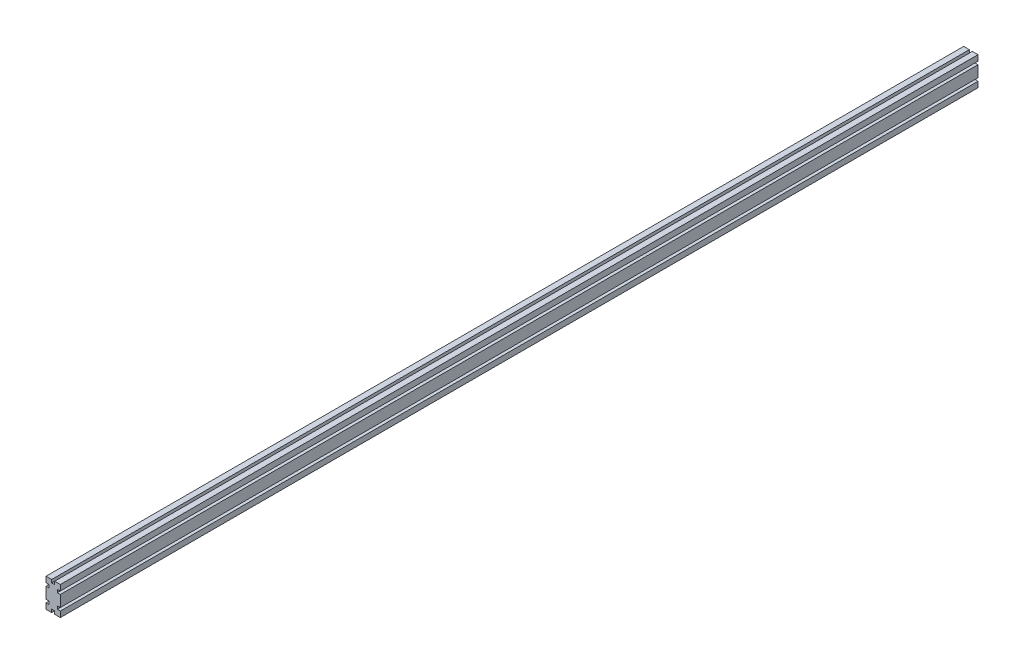
ISO-10303-21;
HEADER;
FILE_DESCRIPTION(('STEP AP214'),'2;1');
FILE_NAME('part.step','',(''),(''),'','','');
FILE_SCHEMA(('AUTOMOTIVE_DESIGN { 1 0 10303 214 1 1 1 1 }'));
ENDSEC;
DATA;
#1=APPLICATION_CONTEXT('core data for automotive mechanical design processes');
#2=APPLICATION_PROTOCOL_DEFINITION('international standard','automotive_design',2000,#1);
#3=PRODUCT_CONTEXT('',#1,'mechanical');
#4=PRODUCT('Part','Part','',(#3));
#5=PRODUCT_RELATED_PRODUCT_CATEGORY('part','',(#4));
#6=PRODUCT_DEFINITION_FORMATION('','',#4);
#7=PRODUCT_DEFINITION_CONTEXT('part definition',#1,'design');
#8=PRODUCT_DEFINITION('design','',#6,#7);
#9=PRODUCT_DEFINITION_SHAPE('','',#8);
#10=(LENGTH_UNIT() NAMED_UNIT(*) SI_UNIT(.MILLI.,.METRE.));
#11=(NAMED_UNIT(*) PLANE_ANGLE_UNIT() SI_UNIT($,.RADIAN.));
#12=(NAMED_UNIT(*) SI_UNIT($,.STERADIAN.) SOLID_ANGLE_UNIT());
#13=UNCERTAINTY_MEASURE_WITH_UNIT(LENGTH_MEASURE(1.E-05),#10,'distance_accuracy_value','');
#14=(GEOMETRIC_REPRESENTATION_CONTEXT(3) GLOBAL_UNCERTAINTY_ASSIGNED_CONTEXT((#13)) GLOBAL_UNIT_ASSIGNED_CONTEXT((#10,
#11,#12)) REPRESENTATION_CONTEXT('',''));
#15=CARTESIAN_POINT('',(0.,0.,0.));
#16=DIRECTION('',(0.,0.,1.));
#17=DIRECTION('',(1.,0.,0.));
#18=AXIS2_PLACEMENT_3D('',#15,#16,#17);
#19=CARTESIAN_POINT('',(-19.05,-23.05,2438.4));
#20=DIRECTION('',(1.,0.,0.));
#21=DIRECTION('',(0.,0.,-1.));
#22=AXIS2_PLACEMENT_3D('',#19,#20,#21);
#23=PLANE('',#22);
#24=DIRECTION('',(0.,-1.,0.));
#25=VECTOR('',#24,1.);
#26=CARTESIAN_POINT('',(-19.05,-23.05,0.));
#27=LINE('',#26,#25);
#28=CARTESIAN_POINT('',(-19.05,-23.05,0.));
#29=VERTEX_POINT('',#28);
#30=CARTESIAN_POINT('',(-19.05,-38.1,0.));
#31=VERTEX_POINT('',#30);
#32=EDGE_CURVE('E255',#29,#31,#27,.T.);
#33=ORIENTED_EDGE('',*,*,#32,.T.);
#34=DIRECTION('',(0.,0.,-1.));
#35=VECTOR('',#34,1.);
#36=CARTESIAN_POINT('',(-19.05,-38.1,2438.4));
#37=LINE('',#36,#35);
#38=CARTESIAN_POINT('',(-19.05,-38.1,2438.4));
#39=VERTEX_POINT('',#38);
#40=EDGE_CURVE('E11',#39,#31,#37,.T.);
#41=ORIENTED_EDGE('',*,*,#40,.F.);
#42=DIRECTION('',(0.,-1.,0.));
#43=VECTOR('',#42,1.);
#44=CARTESIAN_POINT('',(-19.05,-23.05,2438.4));
#45=LINE('',#44,#43);
#46=CARTESIAN_POINT('',(-19.05,-23.05,2438.4));
#47=VERTEX_POINT('',#46);
#48=EDGE_CURVE('E309',#47,#39,#45,.T.);
#49=ORIENTED_EDGE('',*,*,#48,.F.);
#50=DIRECTION('',(0.,0.,-1.));
#51=VECTOR('',#50,1.);
#52=CARTESIAN_POINT('',(-19.05,-23.05,2438.4));
#53=LINE('',#52,#51);
#54=EDGE_CURVE('E251',#47,#29,#53,.T.);
#55=ORIENTED_EDGE('',*,*,#54,.T.);
#56=EDGE_LOOP('',(#33,#41,#49,#55));
#57=FACE_BOUND('',#56,.T.);
#58=ADVANCED_FACE('F39',(#57),#23,.F.);
#59=CARTESIAN_POINT('',(-19.05,-38.1,2438.4));
#60=DIRECTION('',(0.,1.,0.));
#61=DIRECTION('',(0.,0.,1.));
#62=AXIS2_PLACEMENT_3D('',#59,#60,#61);
#63=PLANE('',#62);
#64=DIRECTION('',(1.,0.,0.));
#65=VECTOR('',#64,1.);
#66=CARTESIAN_POINT('',(-19.05,-38.1,0.));
#67=LINE('',#66,#65);
#68=CARTESIAN_POINT('',(-4.,-38.1,0.));
#69=VERTEX_POINT('',#68);
#70=EDGE_CURVE('E258',#31,#69,#67,.T.);
#71=ORIENTED_EDGE('',*,*,#70,.T.);
#72=DIRECTION('',(0.,0.,-1.));
#73=VECTOR('',#72,1.);
#74=CARTESIAN_POINT('',(-4.,-38.1,2438.4));
#75=LINE('',#74,#73);
#76=CARTESIAN_POINT('',(-4.,-38.1,2438.4));
#77=VERTEX_POINT('',#76);
#78=EDGE_CURVE('E47',#77,#69,#75,.T.);
#79=ORIENTED_EDGE('',*,*,#78,.F.);
#80=DIRECTION('',(1.,0.,0.));
#81=VECTOR('',#80,1.);
#82=CARTESIAN_POINT('',(-19.05,-38.1,2438.4));
#83=LINE('',#82,#81);
#84=EDGE_CURVE('E158',#39,#77,#83,.T.);
#85=ORIENTED_EDGE('',*,*,#84,.F.);
#86=ORIENTED_EDGE('',*,*,#40,.T.);
#87=EDGE_LOOP('',(#71,#79,#85,#86));
#88=FACE_BOUND('',#87,.T.);
#89=ADVANCED_FACE('F467',(#88),#63,.F.);
#90=CARTESIAN_POINT('',(-4.,-38.1,2438.4));
#91=DIRECTION('',(-1.,0.,0.));
#92=DIRECTION('',(0.,0.,1.));
#93=AXIS2_PLACEMENT_3D('',#90,#91,#92);
#94=PLANE('',#93);
#95=DIRECTION('',(0.,1.,0.));
#96=VECTOR('',#95,1.);
#97=CARTESIAN_POINT('',(-4.,-38.1,0.));
#98=LINE('',#97,#96);
#99=CARTESIAN_POINT('',(-4.,-30.1,0.));
#100=VERTEX_POINT('',#99);
#101=EDGE_CURVE('E260',#69,#100,#98,.T.);
#102=ORIENTED_EDGE('',*,*,#101,.T.);
#103=DIRECTION('',(0.,0.,-1.));
#104=VECTOR('',#103,1.);
#105=CARTESIAN_POINT('',(-4.,-30.1,2438.4));
#106=LINE('',#105,#104);
#107=CARTESIAN_POINT('',(-4.,-30.1,2438.4));
#108=VERTEX_POINT('',#107);
#109=EDGE_CURVE('E376',#108,#100,#106,.T.);
#110=ORIENTED_EDGE('',*,*,#109,.F.);
#111=DIRECTION('',(0.,1.,0.));
#112=VECTOR('',#111,1.);
#113=CARTESIAN_POINT('',(-4.,-38.1,2438.4));
#114=LINE('',#113,#112);
#115=EDGE_CURVE('E384',#77,#108,#114,.T.);
#116=ORIENTED_EDGE('',*,*,#115,.F.);
#117=ORIENTED_EDGE('',*,*,#78,.T.);
#118=EDGE_LOOP('',(#102,#110,#116,#117));
#119=FACE_BOUND('',#118,.T.);
#120=ADVANCED_FACE('F382',(#119),#94,.F.);
#121=CARTESIAN_POINT('',(-4.,-30.1,2438.4));
#122=DIRECTION('',(0.,1.,0.));
#123=DIRECTION('',(0.,0.,1.));
#124=AXIS2_PLACEMENT_3D('',#121,#122,#123);
#125=PLANE('',#124);
#126=DIRECTION('',(1.,0.,0.));
#127=VECTOR('',#126,1.);
#128=CARTESIAN_POINT('',(-4.,-30.1,0.));
#129=LINE('',#128,#127);
#130=CARTESIAN_POINT('',(4.,-30.1,0.));
#131=VERTEX_POINT('',#130);
#132=EDGE_CURVE('E262',#100,#131,#129,.T.);
#133=ORIENTED_EDGE('',*,*,#132,.T.);
#134=DIRECTION('',(0.,0.,-1.));
#135=VECTOR('',#134,1.);
#136=CARTESIAN_POINT('',(4.,-30.1,2438.4));
#137=LINE('',#136,#135);
#138=CARTESIAN_POINT('',(4.,-30.1,2438.4));
#139=VERTEX_POINT('',#138);
#140=EDGE_CURVE('E373',#139,#131,#137,.T.);
#141=ORIENTED_EDGE('',*,*,#140,.F.);
#142=DIRECTION('',(1.,0.,0.));
#143=VECTOR('',#142,1.);
#144=CARTESIAN_POINT('',(-4.,-30.1,2438.4));
#145=LINE('',#144,#143);
#146=EDGE_CURVE('E402',#108,#139,#145,.T.);
#147=ORIENTED_EDGE('',*,*,#146,.F.);
#148=ORIENTED_EDGE('',*,*,#109,.T.);
#149=EDGE_LOOP('',(#133,#141,#147,#148));
#150=FACE_BOUND('',#149,.T.);
#151=ADVANCED_FACE('F393',(#150),#125,.F.);
#152=CARTESIAN_POINT('',(4.,-30.1,2438.4));
#153=DIRECTION('',(1.,0.,0.));
#154=DIRECTION('',(0.,0.,-1.));
#155=AXIS2_PLACEMENT_3D('',#152,#153,#154);
#156=PLANE('',#155);
#157=DIRECTION('',(0.,-1.,0.));
#158=VECTOR('',#157,1.);
#159=CARTESIAN_POINT('',(4.,-30.1,0.));
#160=LINE('',#159,#158);
#161=CARTESIAN_POINT('',(4.,-38.1,0.));
#162=VERTEX_POINT('',#161);
#163=EDGE_CURVE('E264',#131,#162,#160,.T.);
#164=ORIENTED_EDGE('',*,*,#163,.T.);
#165=DIRECTION('',(0.,0.,-1.));
#166=VECTOR('',#165,1.);
#167=CARTESIAN_POINT('',(4.,-38.1,2438.4));
#168=LINE('',#167,#166);
#169=CARTESIAN_POINT('',(4.,-38.1,2438.4));
#170=VERTEX_POINT('',#169);
#171=EDGE_CURVE('E370',#170,#162,#168,.T.);
#172=ORIENTED_EDGE('',*,*,#171,.F.);
#173=DIRECTION('',(0.,-1.,0.));
#174=VECTOR('',#173,1.);
#175=CARTESIAN_POINT('',(4.,-30.1,2438.4));
#176=LINE('',#175,#174);
#177=EDGE_CURVE('E399',#139,#170,#176,.T.);
#178=ORIENTED_EDGE('',*,*,#177,.F.);
#179=ORIENTED_EDGE('',*,*,#140,.T.);
#180=EDGE_LOOP('',(#164,#172,#178,#179));
#181=FACE_BOUND('',#180,.T.);
#182=ADVANCED_FACE('F397',(#181),#156,.F.);
#183=CARTESIAN_POINT('',(4.,-38.1,2438.4));
#184=DIRECTION('',(0.,1.,0.));
#185=DIRECTION('',(0.,0.,1.));
#186=AXIS2_PLACEMENT_3D('',#183,#184,#185);
#187=PLANE('',#186);
#188=DIRECTION('',(1.,0.,0.));
#189=VECTOR('',#188,1.);
#190=CARTESIAN_POINT('',(4.,-38.1,0.));
#191=LINE('',#190,#189);
#192=CARTESIAN_POINT('',(19.05,-38.1,0.));
#193=VERTEX_POINT('',#192);
#194=EDGE_CURVE('E266',#162,#193,#191,.T.);
#195=ORIENTED_EDGE('',*,*,#194,.T.);
#196=DIRECTION('',(0.,0.,-1.));
#197=VECTOR('',#196,1.);
#198=CARTESIAN_POINT('',(19.05,-38.1,2438.4));
#199=LINE('',#198,#197);
#200=CARTESIAN_POINT('',(19.05,-38.1,2438.4));
#201=VERTEX_POINT('',#200);
#202=EDGE_CURVE('E367',#201,#193,#199,.T.);
#203=ORIENTED_EDGE('',*,*,#202,.F.);
#204=DIRECTION('',(1.,0.,0.));
#205=VECTOR('',#204,1.);
#206=CARTESIAN_POINT('',(4.,-38.1,2438.4));
#207=LINE('',#206,#205);
#208=EDGE_CURVE('E401',#170,#201,#207,.T.);
#209=ORIENTED_EDGE('',*,*,#208,.F.);
#210=ORIENTED_EDGE('',*,*,#171,.T.);
#211=EDGE_LOOP('',(#195,#203,#209,#210));
#212=FACE_BOUND('',#211,.T.);
#213=ADVANCED_FACE('F480',(#212),#187,.F.);
#214=CARTESIAN_POINT('',(19.05,-38.1,2438.4));
#215=DIRECTION('',(-1.,0.,0.));
#216=DIRECTION('',(0.,0.,1.));
#217=AXIS2_PLACEMENT_3D('',#214,#215,#216);
#218=PLANE('',#217);
#219=DIRECTION('',(0.,1.,0.));
#220=VECTOR('',#219,1.);
#221=CARTESIAN_POINT('',(19.05,-38.1,0.));
#222=LINE('',#221,#220);
#223=CARTESIAN_POINT('',(19.05,-23.05,0.));
#224=VERTEX_POINT('',#223);
#225=EDGE_CURVE('E268',#193,#224,#222,.T.);
#226=ORIENTED_EDGE('',*,*,#225,.T.);
#227=DIRECTION('',(0.,0.,-1.));
#228=VECTOR('',#227,1.);
#229=CARTESIAN_POINT('',(19.05,-23.05,2438.4));
#230=LINE('',#229,#228);
#231=CARTESIAN_POINT('',(19.05,-23.05,2438.4));
#232=VERTEX_POINT('',#231);
#233=EDGE_CURVE('E364',#232,#224,#230,.T.);
#234=ORIENTED_EDGE('',*,*,#233,.F.);
#235=DIRECTION('',(0.,1.,0.));
#236=VECTOR('',#235,1.);
#237=CARTESIAN_POINT('',(19.05,-38.1,2438.4));
#238=LINE('',#237,#236);
#239=EDGE_CURVE('E404',#201,#232,#238,.T.);
#240=ORIENTED_EDGE('',*,*,#239,.F.);
#241=ORIENTED_EDGE('',*,*,#202,.T.);
#242=EDGE_LOOP('',(#226,#234,#240,#241));
#243=FACE_BOUND('',#242,.T.);
#244=ADVANCED_FACE('F483',(#243),#218,.F.);
#245=CARTESIAN_POINT('',(19.05,-23.05,2438.4));
#246=DIRECTION('',(0.,-1.,0.));
#247=DIRECTION('',(0.,0.,-1.));
#248=AXIS2_PLACEMENT_3D('',#245,#246,#247);
#249=PLANE('',#248);
#250=DIRECTION('',(-1.,0.,0.));
#251=VECTOR('',#250,1.);
#252=CARTESIAN_POINT('',(19.05,-23.05,0.));
#253=LINE('',#252,#251);
#254=CARTESIAN_POINT('',(11.05,-23.05,0.));
#255=VERTEX_POINT('',#254);
#256=EDGE_CURVE('E270',#224,#255,#253,.T.);
#257=ORIENTED_EDGE('',*,*,#256,.T.);
#258=DIRECTION('',(0.,0.,-1.));
#259=VECTOR('',#258,1.);
#260=CARTESIAN_POINT('',(11.05,-23.05,2438.4));
#261=LINE('',#260,#259);
#262=CARTESIAN_POINT('',(11.05,-23.05,2438.4));
#263=VERTEX_POINT('',#262);
#264=EDGE_CURVE('E361',#263,#255,#261,.T.);
#265=ORIENTED_EDGE('',*,*,#264,.F.);
#266=DIRECTION('',(-1.,0.,0.));
#267=VECTOR('',#266,1.);
#268=CARTESIAN_POINT('',(19.05,-23.05,2438.4));
#269=LINE('',#268,#267);
#270=EDGE_CURVE('E410',#232,#263,#269,.T.);
#271=ORIENTED_EDGE('',*,*,#270,.F.);
#272=ORIENTED_EDGE('',*,*,#233,.T.);
#273=EDGE_LOOP('',(#257,#265,#271,#272));
#274=FACE_BOUND('',#273,.T.);
#275=ADVANCED_FACE('F487',(#274),#249,.F.);
#276=CARTESIAN_POINT('',(11.05,-23.05,2438.4));
#277=DIRECTION('',(-1.,0.,0.));
#278=DIRECTION('',(0.,0.,1.));
#279=AXIS2_PLACEMENT_3D('',#276,#277,#278);
#280=PLANE('',#279);
#281=DIRECTION('',(0.,1.,0.));
#282=VECTOR('',#281,1.);
#283=CARTESIAN_POINT('',(11.05,-23.05,0.));
#284=LINE('',#283,#282);
#285=CARTESIAN_POINT('',(11.05,-15.05,0.));
#286=VERTEX_POINT('',#285);
#287=EDGE_CURVE('E272',#255,#286,#284,.T.);
#288=ORIENTED_EDGE('',*,*,#287,.T.);
#289=DIRECTION('',(0.,0.,-1.));
#290=VECTOR('',#289,1.);
#291=CARTESIAN_POINT('',(11.05,-15.05,2438.4));
#292=LINE('',#291,#290);
#293=CARTESIAN_POINT('',(11.05,-15.05,2438.4));
#294=VERTEX_POINT('',#293);
#295=EDGE_CURVE('E358',#294,#286,#292,.T.);
#296=ORIENTED_EDGE('',*,*,#295,.F.);
#297=DIRECTION('',(0.,1.,0.));
#298=VECTOR('',#297,1.);
#299=CARTESIAN_POINT('',(11.05,-23.05,2438.4));
#300=LINE('',#299,#298);
#301=EDGE_CURVE('E412',#263,#294,#300,.T.);
#302=ORIENTED_EDGE('',*,*,#301,.F.);
#303=ORIENTED_EDGE('',*,*,#264,.T.);
#304=EDGE_LOOP('',(#288,#296,#302,#303));
#305=FACE_BOUND('',#304,.T.);
#306=ADVANCED_FACE('F491',(#305),#280,.F.);
#307=CARTESIAN_POINT('',(11.05,-15.05,2438.4));
#308=DIRECTION('',(0.,1.,0.));
#309=DIRECTION('',(0.,0.,1.));
#310=AXIS2_PLACEMENT_3D('',#307,#308,#309);
#311=PLANE('',#310);
#312=DIRECTION('',(1.,0.,0.));
#313=VECTOR('',#312,1.);
#314=CARTESIAN_POINT('',(11.05,-15.05,0.));
#315=LINE('',#314,#313);
#316=CARTESIAN_POINT('',(19.05,-15.05,0.));
#317=VERTEX_POINT('',#316);
#318=EDGE_CURVE('E274',#286,#317,#315,.T.);
#319=ORIENTED_EDGE('',*,*,#318,.T.);
#320=DIRECTION('',(0.,0.,-1.));
#321=VECTOR('',#320,1.);
#322=CARTESIAN_POINT('',(19.05,-15.05,2438.4));
#323=LINE('',#322,#321);
#324=CARTESIAN_POINT('',(19.05,-15.05,2438.4));
#325=VERTEX_POINT('',#324);
#326=EDGE_CURVE('E355',#325,#317,#323,.T.);
#327=ORIENTED_EDGE('',*,*,#326,.F.);
#328=DIRECTION('',(1.,0.,0.));
#329=VECTOR('',#328,1.);
#330=CARTESIAN_POINT('',(11.05,-15.05,2438.4));
#331=LINE('',#330,#329);
#332=EDGE_CURVE('E414',#294,#325,#331,.T.);
#333=ORIENTED_EDGE('',*,*,#332,.F.);
#334=ORIENTED_EDGE('',*,*,#295,.T.);
#335=EDGE_LOOP('',(#319,#327,#333,#334));
#336=FACE_BOUND('',#335,.T.);
#337=ADVANCED_FACE('F495',(#336),#311,.F.);
#338=CARTESIAN_POINT('',(19.05,-15.05,2438.4));
#339=DIRECTION('',(-1.,0.,0.));
#340=DIRECTION('',(0.,0.,1.));
#341=AXIS2_PLACEMENT_3D('',#338,#339,#340);
#342=PLANE('',#341);
#343=DIRECTION('',(0.,1.,0.));
#344=VECTOR('',#343,1.);
#345=CARTESIAN_POINT('',(19.05,-15.05,0.));
#346=LINE('',#345,#344);
#347=CARTESIAN_POINT('',(19.05,15.05,0.));
#348=VERTEX_POINT('',#347);
#349=EDGE_CURVE('E276',#317,#348,#346,.T.);
#350=ORIENTED_EDGE('',*,*,#349,.T.);
#351=DIRECTION('',(0.,0.,-1.));
#352=VECTOR('',#351,1.);
#353=CARTESIAN_POINT('',(19.05,15.05,2438.4));
#354=LINE('',#353,#352);
#355=CARTESIAN_POINT('',(19.05,15.05,2438.4));
#356=VERTEX_POINT('',#355);
#357=EDGE_CURVE('E352',#356,#348,#354,.T.);
#358=ORIENTED_EDGE('',*,*,#357,.F.);
#359=DIRECTION('',(0.,1.,0.));
#360=VECTOR('',#359,1.);
#361=CARTESIAN_POINT('',(19.05,-15.05,2438.4));
#362=LINE('',#361,#360);
#363=EDGE_CURVE('E416',#325,#356,#362,.T.);
#364=ORIENTED_EDGE('',*,*,#363,.F.);
#365=ORIENTED_EDGE('',*,*,#326,.T.);
#366=EDGE_LOOP('',(#350,#358,#364,#365));
#367=FACE_BOUND('',#366,.T.);
#368=ADVANCED_FACE('F499',(#367),#342,.F.);
#369=CARTESIAN_POINT('',(19.05,15.05,2438.4));
#370=DIRECTION('',(0.,-1.,0.));
#371=DIRECTION('',(0.,0.,-1.));
#372=AXIS2_PLACEMENT_3D('',#369,#370,#371);
#373=PLANE('',#372);
#374=DIRECTION('',(-1.,0.,0.));
#375=VECTOR('',#374,1.);
#376=CARTESIAN_POINT('',(19.05,15.05,0.));
#377=LINE('',#376,#375);
#378=CARTESIAN_POINT('',(11.05,15.05,0.));
#379=VERTEX_POINT('',#378);
#380=EDGE_CURVE('E278',#348,#379,#377,.T.);
#381=ORIENTED_EDGE('',*,*,#380,.T.);
#382=DIRECTION('',(0.,0.,-1.));
#383=VECTOR('',#382,1.);
#384=CARTESIAN_POINT('',(11.05,15.05,2438.4));
#385=LINE('',#384,#383);
#386=CARTESIAN_POINT('',(11.05,15.05,2438.4));
#387=VERTEX_POINT('',#386);
#388=EDGE_CURVE('E349',#387,#379,#385,.T.);
#389=ORIENTED_EDGE('',*,*,#388,.F.);
#390=DIRECTION('',(-1.,0.,0.));
#391=VECTOR('',#390,1.);
#392=CARTESIAN_POINT('',(19.05,15.05,2438.4));
#393=LINE('',#392,#391);
#394=EDGE_CURVE('E418',#356,#387,#393,.T.);
#395=ORIENTED_EDGE('',*,*,#394,.F.);
#396=ORIENTED_EDGE('',*,*,#357,.T.);
#397=EDGE_LOOP('',(#381,#389,#395,#396));
#398=FACE_BOUND('',#397,.T.);
#399=ADVANCED_FACE('F503',(#398),#373,.F.);
#400=CARTESIAN_POINT('',(11.05,15.05,2438.4));
#401=DIRECTION('',(-1.,0.,0.));
#402=DIRECTION('',(0.,0.,1.));
#403=AXIS2_PLACEMENT_3D('',#400,#401,#402);
#404=PLANE('',#403);
#405=DIRECTION('',(0.,1.,0.));
#406=VECTOR('',#405,1.);
#407=CARTESIAN_POINT('',(11.05,15.05,0.));
#408=LINE('',#407,#406);
#409=CARTESIAN_POINT('',(11.05,23.05,0.));
#410=VERTEX_POINT('',#409);
#411=EDGE_CURVE('E280',#379,#410,#408,.T.);
#412=ORIENTED_EDGE('',*,*,#411,.T.);
#413=DIRECTION('',(0.,0.,-1.));
#414=VECTOR('',#413,1.);
#415=CARTESIAN_POINT('',(11.05,23.05,2438.4));
#416=LINE('',#415,#414);
#417=CARTESIAN_POINT('',(11.05,23.05,2438.4));
#418=VERTEX_POINT('',#417);
#419=EDGE_CURVE('E346',#418,#410,#416,.T.);
#420=ORIENTED_EDGE('',*,*,#419,.F.);
#421=DIRECTION('',(0.,1.,0.));
#422=VECTOR('',#421,1.);
#423=CARTESIAN_POINT('',(11.05,15.05,2438.4));
#424=LINE('',#423,#422);
#425=EDGE_CURVE('E420',#387,#418,#424,.T.);
#426=ORIENTED_EDGE('',*,*,#425,.F.);
#427=ORIENTED_EDGE('',*,*,#388,.T.);
#428=EDGE_LOOP('',(#412,#420,#426,#427));
#429=FACE_BOUND('',#428,.T.);
#430=ADVANCED_FACE('F507',(#429),#404,.F.);
#431=CARTESIAN_POINT('',(11.05,23.05,2438.4));
#432=DIRECTION('',(0.,1.,0.));
#433=DIRECTION('',(0.,0.,1.));
#434=AXIS2_PLACEMENT_3D('',#431,#432,#433);
#435=PLANE('',#434);
#436=DIRECTION('',(1.,0.,0.));
#437=VECTOR('',#436,1.);
#438=CARTESIAN_POINT('',(11.05,23.05,0.));
#439=LINE('',#438,#437);
#440=CARTESIAN_POINT('',(19.05,23.05,0.));
#441=VERTEX_POINT('',#440);
#442=EDGE_CURVE('E282',#410,#441,#439,.T.);
#443=ORIENTED_EDGE('',*,*,#442,.T.);
#444=DIRECTION('',(0.,0.,-1.));
#445=VECTOR('',#444,1.);
#446=CARTESIAN_POINT('',(19.05,23.05,2438.4));
#447=LINE('',#446,#445);
#448=CARTESIAN_POINT('',(19.05,23.05,2438.4));
#449=VERTEX_POINT('',#448);
#450=EDGE_CURVE('E343',#449,#441,#447,.T.);
#451=ORIENTED_EDGE('',*,*,#450,.F.);
#452=DIRECTION('',(1.,0.,0.));
#453=VECTOR('',#452,1.);
#454=CARTESIAN_POINT('',(11.05,23.05,2438.4));
#455=LINE('',#454,#453);
#456=EDGE_CURVE('E422',#418,#449,#455,.T.);
#457=ORIENTED_EDGE('',*,*,#456,.F.);
#458=ORIENTED_EDGE('',*,*,#419,.T.);
#459=EDGE_LOOP('',(#443,#451,#457,#458));
#460=FACE_BOUND('',#459,.T.);
#461=ADVANCED_FACE('F511',(#460),#435,.F.);
#462=CARTESIAN_POINT('',(19.05,23.05,2438.4));
#463=DIRECTION('',(-1.,0.,0.));
#464=DIRECTION('',(0.,0.,1.));
#465=AXIS2_PLACEMENT_3D('',#462,#463,#464);
#466=PLANE('',#465);
#467=DIRECTION('',(0.,1.,0.));
#468=VECTOR('',#467,1.);
#469=CARTESIAN_POINT('',(19.05,23.05,0.));
#470=LINE('',#469,#468);
#471=CARTESIAN_POINT('',(19.05,38.1,0.));
#472=VERTEX_POINT('',#471);
#473=EDGE_CURVE('E284',#441,#472,#470,.T.);
#474=ORIENTED_EDGE('',*,*,#473,.T.);
#475=DIRECTION('',(0.,0.,-1.));
#476=VECTOR('',#475,1.);
#477=CARTESIAN_POINT('',(19.05,38.1,2438.4));
#478=LINE('',#477,#476);
#479=CARTESIAN_POINT('',(19.05,38.1,2438.4));
#480=VERTEX_POINT('',#479);
#481=EDGE_CURVE('E340',#480,#472,#478,.T.);
#482=ORIENTED_EDGE('',*,*,#481,.F.);
#483=DIRECTION('',(0.,1.,0.));
#484=VECTOR('',#483,1.);
#485=CARTESIAN_POINT('',(19.05,23.05,2438.4));
#486=LINE('',#485,#484);
#487=EDGE_CURVE('E424',#449,#480,#486,.T.);
#488=ORIENTED_EDGE('',*,*,#487,.F.);
#489=ORIENTED_EDGE('',*,*,#450,.T.);
#490=EDGE_LOOP('',(#474,#482,#488,#489));
#491=FACE_BOUND('',#490,.T.);
#492=ADVANCED_FACE('F515',(#491),#466,.F.);
#493=CARTESIAN_POINT('',(19.05,38.1,2438.4));
#494=DIRECTION('',(0.,-1.,0.));
#495=DIRECTION('',(0.,0.,-1.));
#496=AXIS2_PLACEMENT_3D('',#493,#494,#495);
#497=PLANE('',#496);
#498=DIRECTION('',(-1.,0.,0.));
#499=VECTOR('',#498,1.);
#500=CARTESIAN_POINT('',(19.05,38.1,0.));
#501=LINE('',#500,#499);
#502=CARTESIAN_POINT('',(4.,38.1,0.));
#503=VERTEX_POINT('',#502);
#504=EDGE_CURVE('E286',#472,#503,#501,.T.);
#505=ORIENTED_EDGE('',*,*,#504,.T.);
#506=DIRECTION('',(0.,0.,-1.));
#507=VECTOR('',#506,1.);
#508=CARTESIAN_POINT('',(4.,38.1,2438.4));
#509=LINE('',#508,#507);
#510=CARTESIAN_POINT('',(4.,38.1,2438.4));
#511=VERTEX_POINT('',#510);
#512=EDGE_CURVE('E337',#511,#503,#509,.T.);
#513=ORIENTED_EDGE('',*,*,#512,.F.);
#514=DIRECTION('',(-1.,0.,0.));
#515=VECTOR('',#514,1.);
#516=CARTESIAN_POINT('',(19.05,38.1,2438.4));
#517=LINE('',#516,#515);
#518=EDGE_CURVE('E426',#480,#511,#517,.T.);
#519=ORIENTED_EDGE('',*,*,#518,.F.);
#520=ORIENTED_EDGE('',*,*,#481,.T.);
#521=EDGE_LOOP('',(#505,#513,#519,#520));
#522=FACE_BOUND('',#521,.T.);
#523=ADVANCED_FACE('F519',(#522),#497,.F.);
#524=CARTESIAN_POINT('',(4.,38.1,2438.4));
#525=DIRECTION('',(1.,0.,0.));
#526=DIRECTION('',(0.,0.,-1.));
#527=AXIS2_PLACEMENT_3D('',#524,#525,#526);
#528=PLANE('',#527);
#529=DIRECTION('',(0.,-1.,0.));
#530=VECTOR('',#529,1.);
#531=CARTESIAN_POINT('',(4.,38.1,0.));
#532=LINE('',#531,#530);
#533=CARTESIAN_POINT('',(4.,30.1,0.));
#534=VERTEX_POINT('',#533);
#535=EDGE_CURVE('E288',#503,#534,#532,.T.);
#536=ORIENTED_EDGE('',*,*,#535,.T.);
#537=DIRECTION('',(0.,0.,-1.));
#538=VECTOR('',#537,1.);
#539=CARTESIAN_POINT('',(4.,30.1,2438.4));
#540=LINE('',#539,#538);
#541=CARTESIAN_POINT('',(4.,30.1,2438.4));
#542=VERTEX_POINT('',#541);
#543=EDGE_CURVE('E334',#542,#534,#540,.T.);
#544=ORIENTED_EDGE('',*,*,#543,.F.);
#545=DIRECTION('',(0.,-1.,0.));
#546=VECTOR('',#545,1.);
#547=CARTESIAN_POINT('',(4.,38.1,2438.4));
#548=LINE('',#547,#546);
#549=EDGE_CURVE('E428',#511,#542,#548,.T.);
#550=ORIENTED_EDGE('',*,*,#549,.F.);
#551=ORIENTED_EDGE('',*,*,#512,.T.);
#552=EDGE_LOOP('',(#536,#544,#550,#551));
#553=FACE_BOUND('',#552,.T.);
#554=ADVANCED_FACE('F523',(#553),#528,.F.);
#555=CARTESIAN_POINT('',(4.,30.1,2438.4));
#556=DIRECTION('',(0.,-1.,0.));
#557=DIRECTION('',(0.,0.,-1.));
#558=AXIS2_PLACEMENT_3D('',#555,#556,#557);
#559=PLANE('',#558);
#560=DIRECTION('',(-1.,0.,0.));
#561=VECTOR('',#560,1.);
#562=CARTESIAN_POINT('',(4.,30.1,0.));
#563=LINE('',#562,#561);
#564=CARTESIAN_POINT('',(-4.,30.1,0.));
#565=VERTEX_POINT('',#564);
#566=EDGE_CURVE('E290',#534,#565,#563,.T.);
#567=ORIENTED_EDGE('',*,*,#566,.T.);
#568=DIRECTION('',(0.,0.,-1.));
#569=VECTOR('',#568,1.);
#570=CARTESIAN_POINT('',(-4.,30.1,2438.4));
#571=LINE('',#570,#569);
#572=CARTESIAN_POINT('',(-4.,30.1,2438.4));
#573=VERTEX_POINT('',#572);
#574=EDGE_CURVE('E331',#573,#565,#571,.T.);
#575=ORIENTED_EDGE('',*,*,#574,.F.);
#576=DIRECTION('',(-1.,0.,0.));
#577=VECTOR('',#576,1.);
#578=CARTESIAN_POINT('',(4.,30.1,2438.4));
#579=LINE('',#578,#577);
#580=EDGE_CURVE('E430',#542,#573,#579,.T.);
#581=ORIENTED_EDGE('',*,*,#580,.F.);
#582=ORIENTED_EDGE('',*,*,#543,.T.);
#583=EDGE_LOOP('',(#567,#575,#581,#582));
#584=FACE_BOUND('',#583,.T.);
#585=ADVANCED_FACE('F527',(#584),#559,.F.);
#586=CARTESIAN_POINT('',(-4.,30.1,2438.4));
#587=DIRECTION('',(-1.,0.,0.));
#588=DIRECTION('',(0.,0.,1.));
#589=AXIS2_PLACEMENT_3D('',#586,#587,#588);
#590=PLANE('',#589);
#591=DIRECTION('',(0.,1.,0.));
#592=VECTOR('',#591,1.);
#593=CARTESIAN_POINT('',(-4.,30.1,0.));
#594=LINE('',#593,#592);
#595=CARTESIAN_POINT('',(-4.,38.1,0.));
#596=VERTEX_POINT('',#595);
#597=EDGE_CURVE('E292',#565,#596,#594,.T.);
#598=ORIENTED_EDGE('',*,*,#597,.T.);
#599=DIRECTION('',(0.,0.,-1.));
#600=VECTOR('',#599,1.);
#601=CARTESIAN_POINT('',(-4.,38.1,2438.4));
#602=LINE('',#601,#600);
#603=CARTESIAN_POINT('',(-4.,38.1,2438.4));
#604=VERTEX_POINT('',#603);
#605=EDGE_CURVE('E328',#604,#596,#602,.T.);
#606=ORIENTED_EDGE('',*,*,#605,.F.);
#607=DIRECTION('',(0.,1.,0.));
#608=VECTOR('',#607,1.);
#609=CARTESIAN_POINT('',(-4.,30.1,2438.4));
#610=LINE('',#609,#608);
#611=EDGE_CURVE('E432',#573,#604,#610,.T.);
#612=ORIENTED_EDGE('',*,*,#611,.F.);
#613=ORIENTED_EDGE('',*,*,#574,.T.);
#614=EDGE_LOOP('',(#598,#606,#612,#613));
#615=FACE_BOUND('',#614,.T.);
#616=ADVANCED_FACE('F531',(#615),#590,.F.);
#617=CARTESIAN_POINT('',(-4.,38.1,2438.4));
#618=DIRECTION('',(0.,-1.,0.));
#619=DIRECTION('',(0.,0.,-1.));
#620=AXIS2_PLACEMENT_3D('',#617,#618,#619);
#621=PLANE('',#620);
#622=DIRECTION('',(-1.,0.,0.));
#623=VECTOR('',#622,1.);
#624=CARTESIAN_POINT('',(-4.,38.1,0.));
#625=LINE('',#624,#623);
#626=CARTESIAN_POINT('',(-19.05,38.1,0.));
#627=VERTEX_POINT('',#626);
#628=EDGE_CURVE('E294',#596,#627,#625,.T.);
#629=ORIENTED_EDGE('',*,*,#628,.T.);
#630=DIRECTION('',(0.,0.,-1.));
#631=VECTOR('',#630,1.);
#632=CARTESIAN_POINT('',(-19.05,38.1,2438.4));
#633=LINE('',#632,#631);
#634=CARTESIAN_POINT('',(-19.05,38.1,2438.4));
#635=VERTEX_POINT('',#634);
#636=EDGE_CURVE('E325',#635,#627,#633,.T.);
#637=ORIENTED_EDGE('',*,*,#636,.F.);
#638=DIRECTION('',(-1.,0.,0.));
#639=VECTOR('',#638,1.);
#640=CARTESIAN_POINT('',(-4.,38.1,2438.4));
#641=LINE('',#640,#639);
#642=EDGE_CURVE('E434',#604,#635,#641,.T.);
#643=ORIENTED_EDGE('',*,*,#642,.F.);
#644=ORIENTED_EDGE('',*,*,#605,.T.);
#645=EDGE_LOOP('',(#629,#637,#643,#644));
#646=FACE_BOUND('',#645,.T.);
#647=ADVANCED_FACE('F535',(#646),#621,.F.);
#648=CARTESIAN_POINT('',(-19.05,38.1,2438.4));
#649=DIRECTION('',(1.,0.,0.));
#650=DIRECTION('',(0.,0.,-1.));
#651=AXIS2_PLACEMENT_3D('',#648,#649,#650);
#652=PLANE('',#651);
#653=DIRECTION('',(0.,-1.,0.));
#654=VECTOR('',#653,1.);
#655=CARTESIAN_POINT('',(-19.05,38.1,0.));
#656=LINE('',#655,#654);
#657=CARTESIAN_POINT('',(-19.05,23.05,0.));
#658=VERTEX_POINT('',#657);
#659=EDGE_CURVE('E296',#627,#658,#656,.T.);
#660=ORIENTED_EDGE('',*,*,#659,.T.);
#661=DIRECTION('',(0.,0.,-1.));
#662=VECTOR('',#661,1.);
#663=CARTESIAN_POINT('',(-19.05,23.05,2438.4));
#664=LINE('',#663,#662);
#665=CARTESIAN_POINT('',(-19.05,23.05,2438.4));
#666=VERTEX_POINT('',#665);
#667=EDGE_CURVE('E322',#666,#658,#664,.T.);
#668=ORIENTED_EDGE('',*,*,#667,.F.);
#669=DIRECTION('',(0.,-1.,0.));
#670=VECTOR('',#669,1.);
#671=CARTESIAN_POINT('',(-19.05,38.1,2438.4));
#672=LINE('',#671,#670);
#673=EDGE_CURVE('E436',#635,#666,#672,.T.);
#674=ORIENTED_EDGE('',*,*,#673,.F.);
#675=ORIENTED_EDGE('',*,*,#636,.T.);
#676=EDGE_LOOP('',(#660,#668,#674,#675));
#677=FACE_BOUND('',#676,.T.);
#678=ADVANCED_FACE('F539',(#677),#652,.F.);
#679=CARTESIAN_POINT('',(-19.05,23.05,2438.4));
#680=DIRECTION('',(0.,1.,0.));
#681=DIRECTION('',(0.,0.,1.));
#682=AXIS2_PLACEMENT_3D('',#679,#680,#681);
#683=PLANE('',#682);
#684=DIRECTION('',(1.,0.,0.));
#685=VECTOR('',#684,1.);
#686=CARTESIAN_POINT('',(-19.05,23.05,0.));
#687=LINE('',#686,#685);
#688=CARTESIAN_POINT('',(-11.05,23.05,0.));
#689=VERTEX_POINT('',#688);
#690=EDGE_CURVE('E298',#658,#689,#687,.T.);
#691=ORIENTED_EDGE('',*,*,#690,.T.);
#692=DIRECTION('',(0.,0.,-1.));
#693=VECTOR('',#692,1.);
#694=CARTESIAN_POINT('',(-11.05,23.05,2438.4));
#695=LINE('',#694,#693);
#696=CARTESIAN_POINT('',(-11.05,23.05,2438.4));
#697=VERTEX_POINT('',#696);
#698=EDGE_CURVE('E319',#697,#689,#695,.T.);
#699=ORIENTED_EDGE('',*,*,#698,.F.);
#700=DIRECTION('',(1.,0.,0.));
#701=VECTOR('',#700,1.);
#702=CARTESIAN_POINT('',(-19.05,23.05,2438.4));
#703=LINE('',#702,#701);
#704=EDGE_CURVE('E438',#666,#697,#703,.T.);
#705=ORIENTED_EDGE('',*,*,#704,.F.);
#706=ORIENTED_EDGE('',*,*,#667,.T.);
#707=EDGE_LOOP('',(#691,#699,#705,#706));
#708=FACE_BOUND('',#707,.T.);
#709=ADVANCED_FACE('F543',(#708),#683,.F.);
#710=CARTESIAN_POINT('',(-11.05,23.05,2438.4));
#711=DIRECTION('',(1.,0.,0.));
#712=DIRECTION('',(0.,0.,-1.));
#713=AXIS2_PLACEMENT_3D('',#710,#711,#712);
#714=PLANE('',#713);
#715=DIRECTION('',(0.,-1.,0.));
#716=VECTOR('',#715,1.);
#717=CARTESIAN_POINT('',(-11.05,23.05,0.));
#718=LINE('',#717,#716);
#719=CARTESIAN_POINT('',(-11.05,15.05,0.));
#720=VERTEX_POINT('',#719);
#721=EDGE_CURVE('E300',#689,#720,#718,.T.);
#722=ORIENTED_EDGE('',*,*,#721,.T.);
#723=DIRECTION('',(0.,0.,-1.));
#724=VECTOR('',#723,1.);
#725=CARTESIAN_POINT('',(-11.05,15.05,2438.4));
#726=LINE('',#725,#724);
#727=CARTESIAN_POINT('',(-11.05,15.05,2438.4));
#728=VERTEX_POINT('',#727);
#729=EDGE_CURVE('E316',#728,#720,#726,.T.);
#730=ORIENTED_EDGE('',*,*,#729,.F.);
#731=DIRECTION('',(0.,-1.,0.));
#732=VECTOR('',#731,1.);
#733=CARTESIAN_POINT('',(-11.05,23.05,2438.4));
#734=LINE('',#733,#732);
#735=EDGE_CURVE('E440',#697,#728,#734,.T.);
#736=ORIENTED_EDGE('',*,*,#735,.F.);
#737=ORIENTED_EDGE('',*,*,#698,.T.);
#738=EDGE_LOOP('',(#722,#730,#736,#737));
#739=FACE_BOUND('',#738,.T.);
#740=ADVANCED_FACE('F547',(#739),#714,.F.);
#741=CARTESIAN_POINT('',(-11.05,15.05,2438.4));
#742=DIRECTION('',(0.,-1.,0.));
#743=DIRECTION('',(0.,0.,-1.));
#744=AXIS2_PLACEMENT_3D('',#741,#742,#743);
#745=PLANE('',#744);
#746=DIRECTION('',(-1.,0.,0.));
#747=VECTOR('',#746,1.);
#748=CARTESIAN_POINT('',(-11.05,15.05,0.));
#749=LINE('',#748,#747);
#750=CARTESIAN_POINT('',(-19.05,15.05,0.));
#751=VERTEX_POINT('',#750);
#752=EDGE_CURVE('E302',#720,#751,#749,.T.);
#753=ORIENTED_EDGE('',*,*,#752,.T.);
#754=DIRECTION('',(0.,0.,-1.));
#755=VECTOR('',#754,1.);
#756=CARTESIAN_POINT('',(-19.05,15.05,2438.4));
#757=LINE('',#756,#755);
#758=CARTESIAN_POINT('',(-19.05,15.05,2438.4));
#759=VERTEX_POINT('',#758);
#760=EDGE_CURVE('E313',#759,#751,#757,.T.);
#761=ORIENTED_EDGE('',*,*,#760,.F.);
#762=DIRECTION('',(-1.,0.,0.));
#763=VECTOR('',#762,1.);
#764=CARTESIAN_POINT('',(-11.05,15.05,2438.4));
#765=LINE('',#764,#763);
#766=EDGE_CURVE('E442',#728,#759,#765,.T.);
#767=ORIENTED_EDGE('',*,*,#766,.F.);
#768=ORIENTED_EDGE('',*,*,#729,.T.);
#769=EDGE_LOOP('',(#753,#761,#767,#768));
#770=FACE_BOUND('',#769,.T.);
#771=ADVANCED_FACE('F448',(#770),#745,.F.);
#772=CARTESIAN_POINT('',(-19.05,15.05,2438.4));
#773=DIRECTION('',(1.,0.,0.));
#774=DIRECTION('',(0.,0.,-1.));
#775=AXIS2_PLACEMENT_3D('',#772,#773,#774);
#776=PLANE('',#775);
#777=DIRECTION('',(0.,-1.,0.));
#778=VECTOR('',#777,1.);
#779=CARTESIAN_POINT('',(-19.05,15.05,0.));
#780=LINE('',#779,#778);
#781=CARTESIAN_POINT('',(-19.05,-15.05,0.));
#782=VERTEX_POINT('',#781);
#783=EDGE_CURVE('E304',#751,#782,#780,.T.);
#784=ORIENTED_EDGE('',*,*,#783,.T.);
#785=DIRECTION('',(0.,0.,-1.));
#786=VECTOR('',#785,1.);
#787=CARTESIAN_POINT('',(-19.05,-15.05,2438.4));
#788=LINE('',#787,#786);
#789=CARTESIAN_POINT('',(-19.05,-15.05,2438.4));
#790=VERTEX_POINT('',#789);
#791=EDGE_CURVE('E246',#790,#782,#788,.T.);
#792=ORIENTED_EDGE('',*,*,#791,.F.);
#793=DIRECTION('',(0.,-1.,0.));
#794=VECTOR('',#793,1.);
#795=CARTESIAN_POINT('',(-19.05,15.05,2438.4));
#796=LINE('',#795,#794);
#797=EDGE_CURVE('E237',#759,#790,#796,.T.);
#798=ORIENTED_EDGE('',*,*,#797,.F.);
#799=ORIENTED_EDGE('',*,*,#760,.T.);
#800=EDGE_LOOP('',(#784,#792,#798,#799));
#801=FACE_BOUND('',#800,.T.);
#802=ADVANCED_FACE('F452',(#801),#776,.F.);
#803=CARTESIAN_POINT('',(-19.05,-15.05,2438.4));
#804=DIRECTION('',(0.,1.,0.));
#805=DIRECTION('',(0.,0.,1.));
#806=AXIS2_PLACEMENT_3D('',#803,#804,#805);
#807=PLANE('',#806);
#808=DIRECTION('',(1.,0.,0.));
#809=VECTOR('',#808,1.);
#810=CARTESIAN_POINT('',(-19.05,-15.05,0.));
#811=LINE('',#810,#809);
#812=CARTESIAN_POINT('',(-11.05,-15.05,0.));
#813=VERTEX_POINT('',#812);
#814=EDGE_CURVE('E245',#782,#813,#811,.T.);
#815=ORIENTED_EDGE('',*,*,#814,.T.);
#816=DIRECTION('',(0.,0.,-1.));
#817=VECTOR('',#816,1.);
#818=CARTESIAN_POINT('',(-11.05,-15.05,2438.4));
#819=LINE('',#818,#817);
#820=CARTESIAN_POINT('',(-11.05,-15.05,2438.4));
#821=VERTEX_POINT('',#820);
#822=EDGE_CURVE('E242',#821,#813,#819,.T.);
#823=ORIENTED_EDGE('',*,*,#822,.F.);
#824=DIRECTION('',(1.,0.,0.));
#825=VECTOR('',#824,1.);
#826=CARTESIAN_POINT('',(-19.05,-15.05,2438.4));
#827=LINE('',#826,#825);
#828=EDGE_CURVE('E231',#790,#821,#827,.T.);
#829=ORIENTED_EDGE('',*,*,#828,.F.);
#830=ORIENTED_EDGE('',*,*,#791,.T.);
#831=EDGE_LOOP('',(#815,#823,#829,#830));
#832=FACE_BOUND('',#831,.T.);
#833=ADVANCED_FACE('F243',(#832),#807,.F.);
#834=CARTESIAN_POINT('',(-11.05,-15.05,2438.4));
#835=DIRECTION('',(1.,0.,0.));
#836=DIRECTION('',(0.,0.,-1.));
#837=AXIS2_PLACEMENT_3D('',#834,#835,#836);
#838=PLANE('',#837);
#839=DIRECTION('',(0.,-1.,0.));
#840=VECTOR('',#839,1.);
#841=CARTESIAN_POINT('',(-11.05,-15.05,0.));
#842=LINE('',#841,#840);
#843=CARTESIAN_POINT('',(-11.05,-23.05,0.));
#844=VERTEX_POINT('',#843);
#845=EDGE_CURVE('E144',#813,#844,#842,.T.);
#846=ORIENTED_EDGE('',*,*,#845,.T.);
#847=DIRECTION('',(0.,0.,-1.));
#848=VECTOR('',#847,1.);
#849=CARTESIAN_POINT('',(-11.05,-23.05,2438.4));
#850=LINE('',#849,#848);
#851=CARTESIAN_POINT('',(-11.05,-23.05,2438.4));
#852=VERTEX_POINT('',#851);
#853=EDGE_CURVE('E247',#852,#844,#850,.T.);
#854=ORIENTED_EDGE('',*,*,#853,.F.);
#855=DIRECTION('',(0.,-1.,0.));
#856=VECTOR('',#855,1.);
#857=CARTESIAN_POINT('',(-11.05,-15.05,2438.4));
#858=LINE('',#857,#856);
#859=EDGE_CURVE('E235',#821,#852,#858,.T.);
#860=ORIENTED_EDGE('',*,*,#859,.F.);
#861=ORIENTED_EDGE('',*,*,#822,.T.);
#862=EDGE_LOOP('',(#846,#854,#860,#861));
#863=FACE_BOUND('',#862,.T.);
#864=ADVANCED_FACE('F249',(#863),#838,.F.);
#865=CARTESIAN_POINT('',(-11.05,-23.05,2438.4));
#866=DIRECTION('',(0.,-1.,0.));
#867=DIRECTION('',(0.,0.,-1.));
#868=AXIS2_PLACEMENT_3D('',#865,#866,#867);
#869=PLANE('',#868);
#870=DIRECTION('',(-1.,0.,0.));
#871=VECTOR('',#870,1.);
#872=CARTESIAN_POINT('',(-11.05,-23.05,0.));
#873=LINE('',#872,#871);
#874=EDGE_CURVE('E150',#844,#29,#873,.T.);
#875=ORIENTED_EDGE('',*,*,#874,.T.);
#876=ORIENTED_EDGE('',*,*,#54,.F.);
#877=DIRECTION('',(-1.,0.,0.));
#878=VECTOR('',#877,1.);
#879=CARTESIAN_POINT('',(-11.05,-23.05,2438.4));
#880=LINE('',#879,#878);
#881=EDGE_CURVE('E55',#852,#47,#880,.T.);
#882=ORIENTED_EDGE('',*,*,#881,.F.);
#883=ORIENTED_EDGE('',*,*,#853,.T.);
#884=EDGE_LOOP('',(#875,#876,#882,#883));
#885=FACE_BOUND('',#884,.T.);
#886=ADVANCED_FACE('F456',(#885),#869,.F.);
#887=CARTESIAN_POINT('',(0.,0.,2438.4));
#888=DIRECTION('',(0.,0.,1.));
#889=DIRECTION('',(1.,0.,0.));
#890=AXIS2_PLACEMENT_3D('',#887,#888,#889);
#891=PLANE('',#890);
#892=ORIENTED_EDGE('',*,*,#48,.T.);
#893=ORIENTED_EDGE('',*,*,#84,.T.);
#894=ORIENTED_EDGE('',*,*,#115,.T.);
#895=ORIENTED_EDGE('',*,*,#146,.T.);
#896=ORIENTED_EDGE('',*,*,#177,.T.);
#897=ORIENTED_EDGE('',*,*,#208,.T.);
#898=ORIENTED_EDGE('',*,*,#239,.T.);
#899=ORIENTED_EDGE('',*,*,#270,.T.);
#900=ORIENTED_EDGE('',*,*,#301,.T.);
#901=ORIENTED_EDGE('',*,*,#332,.T.);
#902=ORIENTED_EDGE('',*,*,#363,.T.);
#903=ORIENTED_EDGE('',*,*,#394,.T.);
#904=ORIENTED_EDGE('',*,*,#425,.T.);
#905=ORIENTED_EDGE('',*,*,#456,.T.);
#906=ORIENTED_EDGE('',*,*,#487,.T.);
#907=ORIENTED_EDGE('',*,*,#518,.T.);
#908=ORIENTED_EDGE('',*,*,#549,.T.);
#909=ORIENTED_EDGE('',*,*,#580,.T.);
#910=ORIENTED_EDGE('',*,*,#611,.T.);
#911=ORIENTED_EDGE('',*,*,#642,.T.);
#912=ORIENTED_EDGE('',*,*,#673,.T.);
#913=ORIENTED_EDGE('',*,*,#704,.T.);
#914=ORIENTED_EDGE('',*,*,#735,.T.);
#915=ORIENTED_EDGE('',*,*,#766,.T.);
#916=ORIENTED_EDGE('',*,*,#797,.T.);
#917=ORIENTED_EDGE('',*,*,#828,.T.);
#918=ORIENTED_EDGE('',*,*,#859,.T.);
#919=ORIENTED_EDGE('',*,*,#881,.T.);
#920=EDGE_LOOP('',(#892,#893,#894,#895,#896,#897,#898,#899,#900,#901,#902,#903,#904,#905,#906,
#907,#908,#909,#910,#911,#912,#913,#914,#915,#916,#917,#918,#919));
#921=FACE_BOUND('',#920,.T.);
#922=ADVANCED_FACE('F233',(#921),#891,.T.);
#923=CARTESIAN_POINT('',(0.,0.,0.));
#924=DIRECTION('',(0.,0.,1.));
#925=DIRECTION('',(1.,0.,0.));
#926=AXIS2_PLACEMENT_3D('',#923,#924,#925);
#927=PLANE('',#926);
#928=ORIENTED_EDGE('',*,*,#32,.F.);
#929=ORIENTED_EDGE('',*,*,#874,.F.);
#930=ORIENTED_EDGE('',*,*,#845,.F.);
#931=ORIENTED_EDGE('',*,*,#814,.F.);
#932=ORIENTED_EDGE('',*,*,#783,.F.);
#933=ORIENTED_EDGE('',*,*,#752,.F.);
#934=ORIENTED_EDGE('',*,*,#721,.F.);
#935=ORIENTED_EDGE('',*,*,#690,.F.);
#936=ORIENTED_EDGE('',*,*,#659,.F.);
#937=ORIENTED_EDGE('',*,*,#628,.F.);
#938=ORIENTED_EDGE('',*,*,#597,.F.);
#939=ORIENTED_EDGE('',*,*,#566,.F.);
#940=ORIENTED_EDGE('',*,*,#535,.F.);
#941=ORIENTED_EDGE('',*,*,#504,.F.);
#942=ORIENTED_EDGE('',*,*,#473,.F.);
#943=ORIENTED_EDGE('',*,*,#442,.F.);
#944=ORIENTED_EDGE('',*,*,#411,.F.);
#945=ORIENTED_EDGE('',*,*,#380,.F.);
#946=ORIENTED_EDGE('',*,*,#349,.F.);
#947=ORIENTED_EDGE('',*,*,#318,.F.);
#948=ORIENTED_EDGE('',*,*,#287,.F.);
#949=ORIENTED_EDGE('',*,*,#256,.F.);
#950=ORIENTED_EDGE('',*,*,#225,.F.);
#951=ORIENTED_EDGE('',*,*,#194,.F.);
#952=ORIENTED_EDGE('',*,*,#163,.F.);
#953=ORIENTED_EDGE('',*,*,#132,.F.);
#954=ORIENTED_EDGE('',*,*,#101,.F.);
#955=ORIENTED_EDGE('',*,*,#70,.F.);
#956=EDGE_LOOP('',(#928,#929,#930,#931,#932,#933,#934,#935,#936,#937,#938,#939,#940,#941,#942,
#943,#944,#945,#946,#947,#948,#949,#950,#951,#952,#953,#954,#955));
#957=FACE_BOUND('',#956,.T.);
#958=ADVANCED_FACE('F388',(#957),#927,.F.);
#959=CLOSED_SHELL('',(#58,#89,#120,#151,#182,#213,#244,#275,#306,#337,#368,#399,#430,#461,#492,
#523,#554,#585,#616,#647,#678,#709,#740,#771,#802,#833,#864,#886,#922,#958));
#960=MANIFOLD_SOLID_BREP('B2',#959);
#961=ADVANCED_BREP_SHAPE_REPRESENTATION('',(#18,#960),#14);
#962=SHAPE_DEFINITION_REPRESENTATION(#9,#961);
ENDSEC;
END-ISO-10303-21;
